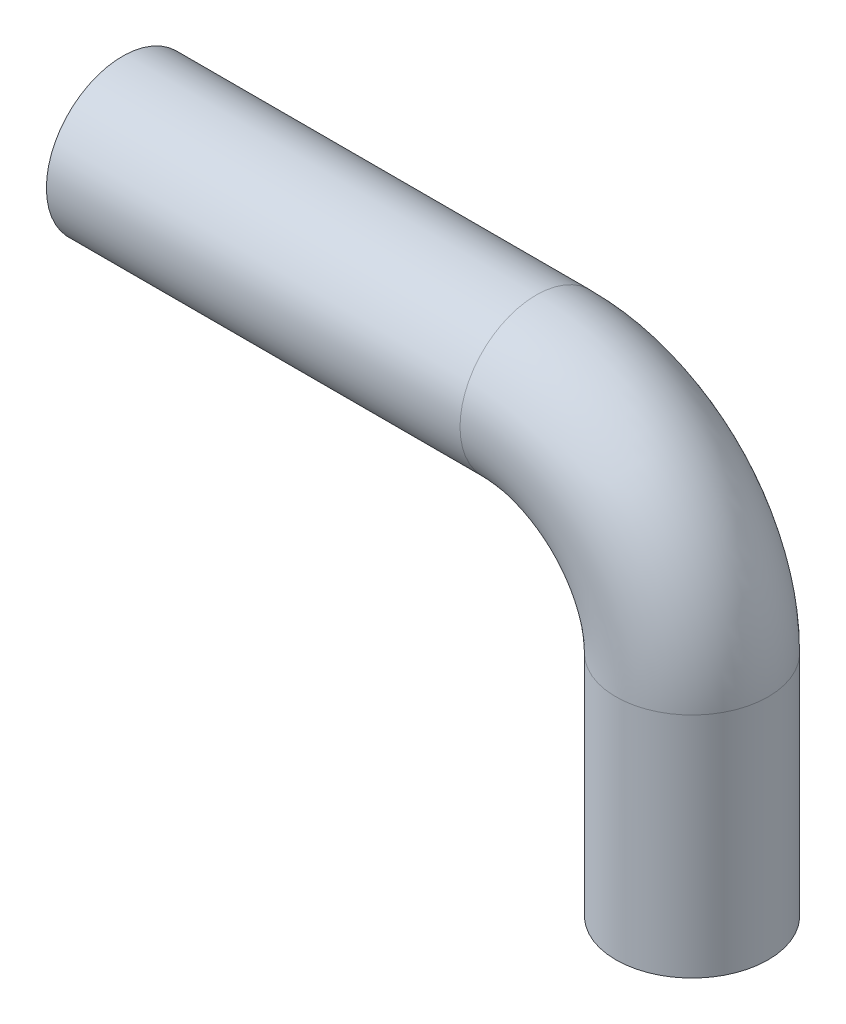
ISO-10303-21;
HEADER;
FILE_DESCRIPTION(('STEP AP214'),'2;1');
FILE_NAME('part.step','',(''),(''),'','','');
FILE_SCHEMA(('AUTOMOTIVE_DESIGN { 1 0 10303 214 1 1 1 1 }'));
ENDSEC;
DATA;
#1=APPLICATION_CONTEXT('core data for automotive mechanical design processes');
#2=APPLICATION_PROTOCOL_DEFINITION('international standard','automotive_design',2000,#1);
#3=PRODUCT_CONTEXT('',#1,'mechanical');
#4=PRODUCT('Part','Part','',(#3));
#5=PRODUCT_RELATED_PRODUCT_CATEGORY('part','',(#4));
#6=PRODUCT_DEFINITION_FORMATION('','',#4);
#7=PRODUCT_DEFINITION_CONTEXT('part definition',#1,'design');
#8=PRODUCT_DEFINITION('design','',#6,#7);
#9=PRODUCT_DEFINITION_SHAPE('','',#8);
#10=(LENGTH_UNIT() NAMED_UNIT(*) SI_UNIT(.MILLI.,.METRE.));
#11=(NAMED_UNIT(*) PLANE_ANGLE_UNIT() SI_UNIT($,.RADIAN.));
#12=(NAMED_UNIT(*) SI_UNIT($,.STERADIAN.) SOLID_ANGLE_UNIT());
#13=UNCERTAINTY_MEASURE_WITH_UNIT(LENGTH_MEASURE(1.E-05),#10,'distance_accuracy_value','');
#14=(GEOMETRIC_REPRESENTATION_CONTEXT(3) GLOBAL_UNCERTAINTY_ASSIGNED_CONTEXT((#13)) GLOBAL_UNIT_ASSIGNED_CONTEXT((#10,
#11,#12)) REPRESENTATION_CONTEXT('',''));
#15=CARTESIAN_POINT('',(0.,0.,0.));
#16=DIRECTION('',(0.,0.,1.));
#17=DIRECTION('',(1.,0.,0.));
#18=AXIS2_PLACEMENT_3D('',#15,#16,#17);
#19=CARTESIAN_POINT('',(0.,10.,0.));
#20=DIRECTION('',(0.,-1.,0.));
#21=DIRECTION('',(0.,0.,-1.));
#22=AXIS2_PLACEMENT_3D('',#19,#20,#21);
#23=CYLINDRICAL_SURFACE('',#22,12.7);
#24=CARTESIAN_POINT('',(0.,0.,0.));
#25=DIRECTION('',(0.,1.,0.));
#26=DIRECTION('',(0.,0.,1.));
#27=AXIS2_PLACEMENT_3D('',#24,#25,#26);
#28=CIRCLE('',#27,12.7);
#29=CARTESIAN_POINT('',(0.,0.,12.7));
#30=VERTEX_POINT('',#29);
#31=EDGE_CURVE('E11',#30,#30,#28,.T.);
#32=ORIENTED_EDGE('',*,*,#31,.T.);
#33=EDGE_LOOP('',(#32));
#34=FACE_BOUND('',#33,.T.);
#35=CARTESIAN_POINT('',(0.,38.,0.));
#36=DIRECTION('',(0.,1.,0.));
#37=DIRECTION('',(0.,0.,1.));
#38=AXIS2_PLACEMENT_3D('',#35,#36,#37);
#39=CIRCLE('',#38,12.7);
#40=CARTESIAN_POINT('',(12.7,38.,0.));
#41=VERTEX_POINT('',#40);
#42=EDGE_CURVE('E47',#41,#41,#39,.T.);
#43=ORIENTED_EDGE('',*,*,#42,.F.);
#44=EDGE_LOOP('',(#43));
#45=FACE_BOUND('',#44,.T.);
#46=ADVANCED_FACE('F33',(#34,#45),#23,.T.);
#47=CARTESIAN_POINT('',(0.,0.,0.));
#48=DIRECTION('',(0.,1.,0.));
#49=DIRECTION('',(0.,0.,1.));
#50=AXIS2_PLACEMENT_3D('',#47,#48,#49);
#51=PLANE('',#50);
#52=ORIENTED_EDGE('',*,*,#31,.F.);
#53=EDGE_LOOP('',(#52));
#54=FACE_BOUND('',#53,.T.);
#55=ADVANCED_FACE('F56',(#54),#51,.F.);
#56=CARTESIAN_POINT('',(-95.,64.,0.));
#57=DIRECTION('',(-1.,0.,0.));
#58=DIRECTION('',(0.,0.,1.));
#59=AXIS2_PLACEMENT_3D('',#56,#57,#58);
#60=PLANE('',#59);
#61=CARTESIAN_POINT('',(-95.,64.,0.));
#62=DIRECTION('',(-1.,0.,0.));
#63=DIRECTION('',(0.,0.,1.));
#64=AXIS2_PLACEMENT_3D('',#61,#62,#63);
#65=CIRCLE('',#64,12.7);
#66=CARTESIAN_POINT('',(-95.,64.,12.7));
#67=VERTEX_POINT('',#66);
#68=EDGE_CURVE('E39',#67,#67,#65,.T.);
#69=ORIENTED_EDGE('',*,*,#68,.T.);
#70=EDGE_LOOP('',(#69));
#71=FACE_BOUND('',#70,.T.);
#72=ADVANCED_FACE('F43',(#71),#60,.T.);
#73=CARTESIAN_POINT('',(-26.,38.,0.));
#74=DIRECTION('',(0.,0.,1.));
#75=DIRECTION('',(1.,0.,0.));
#76=AXIS2_PLACEMENT_3D('',#73,#74,#75);
#77=TOROIDAL_SURFACE('',#76,26.,12.7);
#78=CARTESIAN_POINT('',(-26.,64.,0.));
#79=DIRECTION('',(-1.,0.,0.));
#80=DIRECTION('',(0.,0.,1.));
#81=AXIS2_PLACEMENT_3D('',#78,#79,#80);
#82=CIRCLE('',#81,12.7);
#83=CARTESIAN_POINT('',(-26.,76.7,0.));
#84=VERTEX_POINT('',#83);
#85=EDGE_CURVE('E45',#84,#84,#82,.T.);
#86=CARTESIAN_POINT('',(-26.,38.,0.));
#87=DIRECTION('',(0.,0.,1.));
#88=DIRECTION('',(1.,0.,0.));
#89=AXIS2_PLACEMENT_3D('',#86,#87,#88);
#90=CIRCLE('',#89,38.7);
#91=EDGE_CURVE('',#41,#84,#90,.T.);
#92=ORIENTED_EDGE('',*,*,#42,.T.);
#93=ORIENTED_EDGE('',*,*,#85,.F.);
#94=ORIENTED_EDGE('',*,*,#91,.T.);
#95=ORIENTED_EDGE('',*,*,#91,.F.);
#96=EDGE_LOOP('',(#92,#94,#93,#95));
#97=FACE_BOUND('',#96,.T.);
#98=ADVANCED_FACE('F53',(#97),#77,.T.);
#99=CARTESIAN_POINT('',(-26.,64.,0.));
#100=DIRECTION('',(-1.,0.,0.));
#101=DIRECTION('',(0.,0.,1.));
#102=AXIS2_PLACEMENT_3D('',#99,#100,#101);
#103=CYLINDRICAL_SURFACE('',#102,12.7);
#104=ORIENTED_EDGE('',*,*,#68,.F.);
#105=EDGE_LOOP('',(#104));
#106=FACE_BOUND('',#105,.T.);
#107=ORIENTED_EDGE('',*,*,#85,.T.);
#108=EDGE_LOOP('',(#107));
#109=FACE_BOUND('',#108,.T.);
#110=ADVANCED_FACE('F62',(#106,#109),#103,.T.);
#111=CLOSED_SHELL('',(#46,#55,#72,#98,#110));
#112=MANIFOLD_SOLID_BREP('B2',#111);
#113=ADVANCED_BREP_SHAPE_REPRESENTATION('',(#18,#112),#14);
#114=SHAPE_DEFINITION_REPRESENTATION(#9,#113);
ENDSEC;
END-ISO-10303-21;
